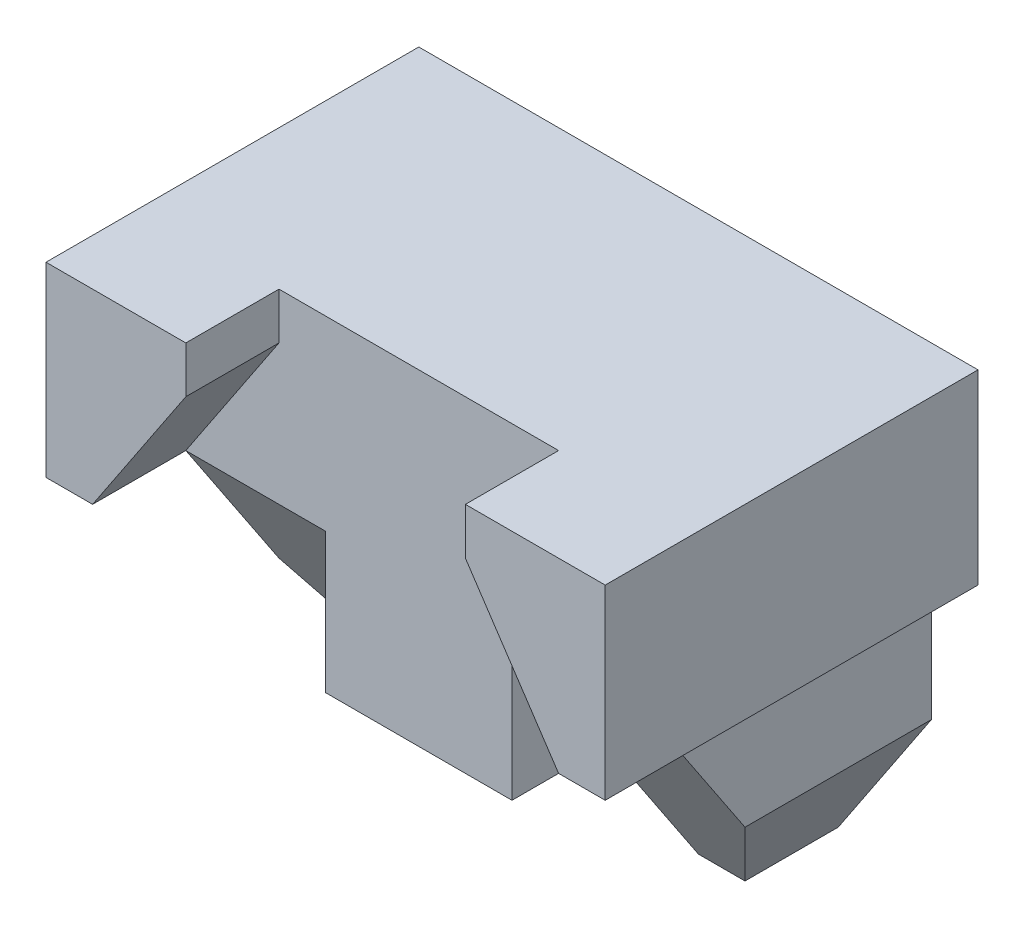
ISO-10303-21;
HEADER;
FILE_DESCRIPTION(('STEP AP214'),'2;1');
FILE_NAME('part.step','',(''),(''),'','','');
FILE_SCHEMA(('AUTOMOTIVE_DESIGN { 1 0 10303 214 1 1 1 1 }'));
ENDSEC;
DATA;
#1=APPLICATION_CONTEXT('core data for automotive mechanical design processes');
#2=APPLICATION_PROTOCOL_DEFINITION('international standard','automotive_design',2000,#1);
#3=PRODUCT_CONTEXT('',#1,'mechanical');
#4=PRODUCT('Part','Part','',(#3));
#5=PRODUCT_RELATED_PRODUCT_CATEGORY('part','',(#4));
#6=PRODUCT_DEFINITION_FORMATION('','',#4);
#7=PRODUCT_DEFINITION_CONTEXT('part definition',#1,'design');
#8=PRODUCT_DEFINITION('design','',#6,#7);
#9=PRODUCT_DEFINITION_SHAPE('','',#8);
#10=(LENGTH_UNIT() NAMED_UNIT(*) SI_UNIT(.MILLI.,.METRE.));
#11=(NAMED_UNIT(*) PLANE_ANGLE_UNIT() SI_UNIT($,.RADIAN.));
#12=(NAMED_UNIT(*) SI_UNIT($,.STERADIAN.) SOLID_ANGLE_UNIT());
#13=UNCERTAINTY_MEASURE_WITH_UNIT(LENGTH_MEASURE(1.E-05),#10,'distance_accuracy_value','');
#14=(GEOMETRIC_REPRESENTATION_CONTEXT(3) GLOBAL_UNCERTAINTY_ASSIGNED_CONTEXT((#13)) GLOBAL_UNIT_ASSIGNED_CONTEXT((#10,
#11,#12)) REPRESENTATION_CONTEXT('',''));
#15=CARTESIAN_POINT('',(0.,0.,0.));
#16=DIRECTION('',(0.,0.,1.));
#17=DIRECTION('',(1.,0.,0.));
#18=AXIS2_PLACEMENT_3D('',#15,#16,#17);
#19=CARTESIAN_POINT('',(0.,0.,60.));
#20=DIRECTION('',(0.,0.,1.));
#21=DIRECTION('',(1.,0.,0.));
#22=AXIS2_PLACEMENT_3D('',#19,#20,#21);
#23=PLANE('',#22);
#24=DIRECTION('',(1.,0.,0.));
#25=VECTOR('',#24,1.);
#26=CARTESIAN_POINT('',(50.,60.,60.));
#27=LINE('',#26,#25);
#28=CARTESIAN_POINT('',(50.,60.,60.));
#29=VERTEX_POINT('',#28);
#30=CARTESIAN_POINT('',(80.,60.,60.));
#31=VERTEX_POINT('',#30);
#32=EDGE_CURVE('E202',#29,#31,#27,.T.);
#33=ORIENTED_EDGE('',*,*,#32,.T.);
#34=DIRECTION('',(0.554700196225229,-0.832050294337844,0.));
#35=VECTOR('',#34,1.);
#36=CARTESIAN_POINT('',(80.,60.,60.));
#37=LINE('',#36,#35);
#38=CARTESIAN_POINT('',(60.,90.,60.));
#39=VERTEX_POINT('',#38);
#40=EDGE_CURVE('E349',#39,#31,#37,.T.);
#41=ORIENTED_EDGE('',*,*,#40,.F.);
#42=DIRECTION('',(0.,-1.,0.));
#43=VECTOR('',#42,1.);
#44=CARTESIAN_POINT('',(60.,90.,60.));
#45=LINE('',#44,#43);
#46=CARTESIAN_POINT('',(60.,100.,60.));
#47=VERTEX_POINT('',#46);
#48=EDGE_CURVE('E352',#47,#39,#45,.T.);
#49=ORIENTED_EDGE('',*,*,#48,.F.);
#50=DIRECTION('',(-1.,0.,0.));
#51=VECTOR('',#50,1.);
#52=CARTESIAN_POINT('',(90.,100.,60.));
#53=LINE('',#52,#51);
#54=CARTESIAN_POINT('',(0.,100.,60.));
#55=VERTEX_POINT('',#54);
#56=EDGE_CURVE('E293',#47,#55,#53,.T.);
#57=ORIENTED_EDGE('',*,*,#56,.T.);
#58=DIRECTION('',(0.,1.,0.));
#59=VECTOR('',#58,1.);
#60=CARTESIAN_POINT('',(0.,90.,60.));
#61=LINE('',#60,#59);
#62=CARTESIAN_POINT('',(0.,90.,60.));
#63=VERTEX_POINT('',#62);
#64=EDGE_CURVE('E381',#63,#55,#61,.T.);
#65=ORIENTED_EDGE('',*,*,#64,.F.);
#66=DIRECTION('',(0.554700196225229,0.832050294337844,0.));
#67=VECTOR('',#66,1.);
#68=CARTESIAN_POINT('',(-20.,60.,60.));
#69=LINE('',#68,#67);
#70=CARTESIAN_POINT('',(-20.,60.,60.));
#71=VERTEX_POINT('',#70);
#72=EDGE_CURVE('E375',#71,#63,#69,.T.);
#73=ORIENTED_EDGE('',*,*,#72,.F.);
#74=DIRECTION('',(-1.,0.,0.));
#75=VECTOR('',#74,1.);
#76=CARTESIAN_POINT('',(10.,60.,60.));
#77=LINE('',#76,#75);
#78=CARTESIAN_POINT('',(10.,60.,60.));
#79=VERTEX_POINT('',#78);
#80=EDGE_CURVE('E471',#79,#71,#77,.T.);
#81=ORIENTED_EDGE('',*,*,#80,.F.);
#82=DIRECTION('',(0.,1.,0.));
#83=VECTOR('',#82,1.);
#84=CARTESIAN_POINT('',(10.,0.,60.));
#85=LINE('',#84,#83);
#86=CARTESIAN_POINT('',(10.,30.,60.));
#87=VERTEX_POINT('',#86);
#88=EDGE_CURVE('E464',#87,#79,#85,.T.);
#89=ORIENTED_EDGE('',*,*,#88,.F.);
#90=DIRECTION('',(1.,0.,0.));
#91=VECTOR('',#90,1.);
#92=CARTESIAN_POINT('',(10.,30.,60.));
#93=LINE('',#92,#91);
#94=CARTESIAN_POINT('',(50.,30.,60.));
#95=VERTEX_POINT('',#94);
#96=EDGE_CURVE('E288',#87,#95,#93,.T.);
#97=ORIENTED_EDGE('',*,*,#96,.T.);
#98=DIRECTION('',(0.,-1.,0.));
#99=VECTOR('',#98,1.);
#100=CARTESIAN_POINT('',(50.,0.,60.));
#101=LINE('',#100,#99);
#102=EDGE_CURVE('E457',#29,#95,#101,.T.);
#103=ORIENTED_EDGE('',*,*,#102,.F.);
#104=EDGE_LOOP('',(#33,#41,#49,#57,#65,#73,#81,#89,#97,#103));
#105=FACE_BOUND('',#104,.T.);
#106=ADVANCED_FACE('F39',(#105),#23,.T.);
#107=CARTESIAN_POINT('',(-20.,30.,60.));
#108=DIRECTION('',(0.832050294337844,0.554700196225229,0.));
#109=DIRECTION('',(-0.554700196225229,0.832050294337844,0.));
#110=AXIS2_PLACEMENT_3D('',#107,#108,#109);
#111=PLANE('',#110);
#112=DIRECTION('',(0.,0.,-1.));
#113=VECTOR('',#112,1.);
#114=CARTESIAN_POINT('',(0.,0.,60.));
#115=LINE('',#114,#113);
#116=CARTESIAN_POINT('',(0.,0.,20.));
#117=VERTEX_POINT('',#116);
#118=CARTESIAN_POINT('',(0.,0.,0.));
#119=VERTEX_POINT('',#118);
#120=EDGE_CURVE('E11',#117,#119,#115,.T.);
#121=ORIENTED_EDGE('',*,*,#120,.F.);
#122=DIRECTION('',(-0.485071250072666,0.727606875108999,0.485071250072666));
#123=VECTOR('',#122,1.);
#124=CARTESIAN_POINT('',(-24.7058823529412,37.0588235294118,44.7058823529412));
#125=LINE('',#124,#123);
#126=CARTESIAN_POINT('',(-20.,30.,40.));
#127=VERTEX_POINT('',#126);
#128=EDGE_CURVE('E355',#117,#127,#125,.T.);
#129=ORIENTED_EDGE('',*,*,#128,.T.);
#130=DIRECTION('',(0.,0.,-1.));
#131=VECTOR('',#130,1.);
#132=CARTESIAN_POINT('',(-20.,30.,60.));
#133=LINE('',#132,#131);
#134=CARTESIAN_POINT('',(-20.,30.,0.));
#135=VERTEX_POINT('',#134);
#136=EDGE_CURVE('E289',#127,#135,#133,.T.);
#137=ORIENTED_EDGE('',*,*,#136,.T.);
#138=DIRECTION('',(0.554700196225229,-0.832050294337844,0.));
#139=VECTOR('',#138,1.);
#140=CARTESIAN_POINT('',(-20.,30.,0.));
#141=LINE('',#140,#139);
#142=EDGE_CURVE('E246',#135,#119,#141,.T.);
#143=ORIENTED_EDGE('',*,*,#142,.T.);
#144=EDGE_LOOP('',(#121,#129,#137,#143));
#145=FACE_BOUND('',#144,.T.);
#146=ADVANCED_FACE('F41',(#145),#111,.F.);
#147=CARTESIAN_POINT('',(0.,0.,60.));
#148=DIRECTION('',(0.,1.,0.));
#149=DIRECTION('',(0.,0.,1.));
#150=AXIS2_PLACEMENT_3D('',#147,#148,#149);
#151=PLANE('',#150);
#152=DIRECTION('',(0.,0.,-1.));
#153=VECTOR('',#152,1.);
#154=CARTESIAN_POINT('',(10.,0.,60.));
#155=LINE('',#154,#153);
#156=CARTESIAN_POINT('',(10.,0.,20.));
#157=VERTEX_POINT('',#156);
#158=CARTESIAN_POINT('',(10.,0.,0.));
#159=VERTEX_POINT('',#158);
#160=EDGE_CURVE('E48',#157,#159,#155,.T.);
#161=ORIENTED_EDGE('',*,*,#160,.F.);
#162=DIRECTION('',(-1.,0.,0.));
#163=VECTOR('',#162,1.);
#164=CARTESIAN_POINT('',(10.,0.,20.));
#165=LINE('',#164,#163);
#166=EDGE_CURVE('E474',#157,#117,#165,.T.);
#167=ORIENTED_EDGE('',*,*,#166,.T.);
#168=ORIENTED_EDGE('',*,*,#120,.T.);
#169=DIRECTION('',(1.,0.,0.));
#170=VECTOR('',#169,1.);
#171=CARTESIAN_POINT('',(0.,0.,0.));
#172=LINE('',#171,#170);
#173=EDGE_CURVE('E239',#119,#159,#172,.T.);
#174=ORIENTED_EDGE('',*,*,#173,.T.);
#175=EDGE_LOOP('',(#161,#167,#168,#174));
#176=FACE_BOUND('',#175,.T.);
#177=ADVANCED_FACE('F240',(#176),#151,.F.);
#178=CARTESIAN_POINT('',(10.,0.,60.));
#179=DIRECTION('',(-1.,0.,0.));
#180=DIRECTION('',(0.,0.,1.));
#181=AXIS2_PLACEMENT_3D('',#178,#179,#180);
#182=PLANE('',#181);
#183=DIRECTION('',(0.,0.,-1.));
#184=VECTOR('',#183,1.);
#185=CARTESIAN_POINT('',(10.,30.,60.));
#186=LINE('',#185,#184);
#187=CARTESIAN_POINT('',(10.,30.,40.));
#188=VERTEX_POINT('',#187);
#189=CARTESIAN_POINT('',(10.,30.,0.));
#190=VERTEX_POINT('',#189);
#191=EDGE_CURVE('E220',#188,#190,#186,.T.);
#192=ORIENTED_EDGE('',*,*,#191,.F.);
#193=DIRECTION('',(0.,-0.832050294337844,-0.554700196225229));
#194=VECTOR('',#193,1.);
#195=CARTESIAN_POINT('',(10.,60.,60.));
#196=LINE('',#195,#194);
#197=EDGE_CURVE('E235',#188,#157,#196,.T.);
#198=ORIENTED_EDGE('',*,*,#197,.T.);
#199=ORIENTED_EDGE('',*,*,#160,.T.);
#200=DIRECTION('',(0.,1.,0.));
#201=VECTOR('',#200,1.);
#202=CARTESIAN_POINT('',(10.,0.,0.));
#203=LINE('',#202,#201);
#204=EDGE_CURVE('E233',#159,#190,#203,.T.);
#205=ORIENTED_EDGE('',*,*,#204,.T.);
#206=EDGE_LOOP('',(#192,#198,#199,#205));
#207=FACE_BOUND('',#206,.T.);
#208=ADVANCED_FACE('F231',(#207),#182,.F.);
#209=CARTESIAN_POINT('',(10.,30.,60.));
#210=DIRECTION('',(0.,1.,0.));
#211=DIRECTION('',(0.,0.,1.));
#212=AXIS2_PLACEMENT_3D('',#209,#210,#211);
#213=PLANE('',#212);
#214=DIRECTION('',(1.,0.,0.));
#215=VECTOR('',#214,1.);
#216=CARTESIAN_POINT('',(10.,30.,0.));
#217=LINE('',#216,#215);
#218=CARTESIAN_POINT('',(50.,30.,0.));
#219=VERTEX_POINT('',#218);
#220=EDGE_CURVE('E250',#190,#219,#217,.T.);
#221=ORIENTED_EDGE('',*,*,#220,.T.);
#222=DIRECTION('',(0.,0.,-1.));
#223=VECTOR('',#222,1.);
#224=CARTESIAN_POINT('',(50.,30.,60.));
#225=LINE('',#224,#223);
#226=CARTESIAN_POINT('',(50.,30.,40.));
#227=VERTEX_POINT('',#226);
#228=EDGE_CURVE('E209',#227,#219,#225,.T.);
#229=ORIENTED_EDGE('',*,*,#228,.F.);
#230=EDGE_CURVE('E213',#95,#227,#225,.T.);
#231=ORIENTED_EDGE('',*,*,#230,.F.);
#232=ORIENTED_EDGE('',*,*,#96,.F.);
#233=EDGE_CURVE('E221',#87,#188,#186,.T.);
#234=ORIENTED_EDGE('',*,*,#233,.T.);
#235=ORIENTED_EDGE('',*,*,#191,.T.);
#236=EDGE_LOOP('',(#221,#229,#231,#232,#234,#235));
#237=FACE_BOUND('',#236,.T.);
#238=ADVANCED_FACE('F522',(#237),#213,.F.);
#239=CARTESIAN_POINT('',(50.,30.,60.));
#240=DIRECTION('',(1.,0.,0.));
#241=DIRECTION('',(0.,0.,-1.));
#242=AXIS2_PLACEMENT_3D('',#239,#240,#241);
#243=PLANE('',#242);
#244=DIRECTION('',(0.,0.,-1.));
#245=VECTOR('',#244,1.);
#246=CARTESIAN_POINT('',(50.,0.,60.));
#247=LINE('',#246,#245);
#248=CARTESIAN_POINT('',(50.,0.,20.));
#249=VERTEX_POINT('',#248);
#250=CARTESIAN_POINT('',(50.,0.,0.));
#251=VERTEX_POINT('',#250);
#252=EDGE_CURVE('E198',#249,#251,#247,.T.);
#253=ORIENTED_EDGE('',*,*,#252,.F.);
#254=DIRECTION('',(0.,0.832050294337844,0.554700196225229));
#255=VECTOR('',#254,1.);
#256=CARTESIAN_POINT('',(50.,60.,60.));
#257=LINE('',#256,#255);
#258=EDGE_CURVE('E183',#249,#227,#257,.T.);
#259=ORIENTED_EDGE('',*,*,#258,.T.);
#260=ORIENTED_EDGE('',*,*,#228,.T.);
#261=DIRECTION('',(0.,-1.,0.));
#262=VECTOR('',#261,1.);
#263=CARTESIAN_POINT('',(50.,30.,0.));
#264=LINE('',#263,#262);
#265=EDGE_CURVE('E206',#219,#251,#264,.T.);
#266=ORIENTED_EDGE('',*,*,#265,.T.);
#267=EDGE_LOOP('',(#253,#259,#260,#266));
#268=FACE_BOUND('',#267,.T.);
#269=ADVANCED_FACE('F204',(#268),#243,.F.);
#270=CARTESIAN_POINT('',(50.,0.,60.));
#271=DIRECTION('',(0.,1.,0.));
#272=DIRECTION('',(0.,0.,1.));
#273=AXIS2_PLACEMENT_3D('',#270,#271,#272);
#274=PLANE('',#273);
#275=DIRECTION('',(0.,0.,-1.));
#276=VECTOR('',#275,1.);
#277=CARTESIAN_POINT('',(60.,0.,60.));
#278=LINE('',#277,#276);
#279=CARTESIAN_POINT('',(60.,0.,20.));
#280=VERTEX_POINT('',#279);
#281=CARTESIAN_POINT('',(60.,0.,0.));
#282=VERTEX_POINT('',#281);
#283=EDGE_CURVE('E200',#280,#282,#278,.T.);
#284=ORIENTED_EDGE('',*,*,#283,.F.);
#285=DIRECTION('',(1.,0.,0.));
#286=VECTOR('',#285,1.);
#287=CARTESIAN_POINT('',(50.,0.,20.));
#288=LINE('',#287,#286);
#289=EDGE_CURVE('E186',#249,#280,#288,.T.);
#290=ORIENTED_EDGE('',*,*,#289,.F.);
#291=ORIENTED_EDGE('',*,*,#252,.T.);
#292=DIRECTION('',(1.,0.,0.));
#293=VECTOR('',#292,1.);
#294=CARTESIAN_POINT('',(50.,0.,0.));
#295=LINE('',#294,#293);
#296=EDGE_CURVE('E259',#251,#282,#295,.T.);
#297=ORIENTED_EDGE('',*,*,#296,.T.);
#298=EDGE_LOOP('',(#284,#290,#291,#297));
#299=FACE_BOUND('',#298,.T.);
#300=ADVANCED_FACE('F196',(#299),#274,.F.);
#301=CARTESIAN_POINT('',(60.,0.,60.));
#302=DIRECTION('',(-0.832050294337844,0.554700196225229,0.));
#303=DIRECTION('',(-0.554700196225229,-0.832050294337844,0.));
#304=AXIS2_PLACEMENT_3D('',#301,#302,#303);
#305=PLANE('',#304);
#306=DIRECTION('',(0.,0.,-1.));
#307=VECTOR('',#306,1.);
#308=CARTESIAN_POINT('',(80.,30.,60.));
#309=LINE('',#308,#307);
#310=CARTESIAN_POINT('',(80.,30.,40.));
#311=VERTEX_POINT('',#310);
#312=CARTESIAN_POINT('',(80.,30.,0.));
#313=VERTEX_POINT('',#312);
#314=EDGE_CURVE('E215',#311,#313,#309,.T.);
#315=ORIENTED_EDGE('',*,*,#314,.F.);
#316=DIRECTION('',(-0.485071250072666,-0.727606875108999,-0.485071250072666));
#317=VECTOR('',#316,1.);
#318=CARTESIAN_POINT('',(69.4117647058823,14.1176470588235,29.4117647058824));
#319=LINE('',#318,#317);
#320=EDGE_CURVE('E55',#311,#280,#319,.T.);
#321=ORIENTED_EDGE('',*,*,#320,.T.);
#322=ORIENTED_EDGE('',*,*,#283,.T.);
#323=DIRECTION('',(0.554700196225229,0.832050294337844,0.));
#324=VECTOR('',#323,1.);
#325=CARTESIAN_POINT('',(60.,0.,0.));
#326=LINE('',#325,#324);
#327=EDGE_CURVE('E262',#282,#313,#326,.T.);
#328=ORIENTED_EDGE('',*,*,#327,.T.);
#329=EDGE_LOOP('',(#315,#321,#322,#328));
#330=FACE_BOUND('',#329,.T.);
#331=ADVANCED_FACE('F325',(#330),#305,.F.);
#332=CARTESIAN_POINT('',(80.,30.,60.));
#333=DIRECTION('',(-1.,0.,0.));
#334=DIRECTION('',(0.,0.,1.));
#335=AXIS2_PLACEMENT_3D('',#332,#333,#334);
#336=PLANE('',#335);
#337=DIRECTION('',(0.,0.,-1.));
#338=VECTOR('',#337,1.);
#339=CARTESIAN_POINT('',(80.,60.,60.));
#340=LINE('',#339,#338);
#341=CARTESIAN_POINT('',(80.,60.,0.));
#342=VERTEX_POINT('',#341);
#343=EDGE_CURVE('E313',#31,#342,#340,.T.);
#344=ORIENTED_EDGE('',*,*,#343,.F.);
#345=DIRECTION('',(0.,0.832050294337844,0.554700196225229));
#346=VECTOR('',#345,1.);
#347=CARTESIAN_POINT('',(80.,60.,60.));
#348=LINE('',#347,#346);
#349=EDGE_CURVE('E322',#311,#31,#348,.T.);
#350=ORIENTED_EDGE('',*,*,#349,.F.);
#351=ORIENTED_EDGE('',*,*,#314,.T.);
#352=DIRECTION('',(0.,1.,0.));
#353=VECTOR('',#352,1.);
#354=CARTESIAN_POINT('',(80.,30.,0.));
#355=LINE('',#354,#353);
#356=EDGE_CURVE('E266',#313,#342,#355,.T.);
#357=ORIENTED_EDGE('',*,*,#356,.T.);
#358=EDGE_LOOP('',(#344,#350,#351,#357));
#359=FACE_BOUND('',#358,.T.);
#360=ADVANCED_FACE('F320',(#359),#336,.F.);
#361=CARTESIAN_POINT('',(80.,60.,60.));
#362=DIRECTION('',(0.,1.,0.));
#363=DIRECTION('',(0.,0.,1.));
#364=AXIS2_PLACEMENT_3D('',#361,#362,#363);
#365=PLANE('',#364);
#366=DIRECTION('',(1.,0.,0.));
#367=VECTOR('',#366,1.);
#368=CARTESIAN_POINT('',(80.,60.,0.));
#369=LINE('',#368,#367);
#370=CARTESIAN_POINT('',(90.,60.,0.));
#371=VERTEX_POINT('',#370);
#372=EDGE_CURVE('E269',#342,#371,#369,.T.);
#373=ORIENTED_EDGE('',*,*,#372,.T.);
#374=DIRECTION('',(0.,0.,-1.));
#375=VECTOR('',#374,1.);
#376=CARTESIAN_POINT('',(90.,60.,60.));
#377=LINE('',#376,#375);
#378=CARTESIAN_POINT('',(90.,60.,80.));
#379=VERTEX_POINT('',#378);
#380=EDGE_CURVE('E309',#379,#371,#377,.T.);
#381=ORIENTED_EDGE('',*,*,#380,.F.);
#382=DIRECTION('',(1.,0.,0.));
#383=VECTOR('',#382,1.);
#384=CARTESIAN_POINT('',(90.,60.,80.));
#385=LINE('',#384,#383);
#386=CARTESIAN_POINT('',(80.,60.,80.));
#387=VERTEX_POINT('',#386);
#388=EDGE_CURVE('E343',#387,#379,#385,.T.);
#389=ORIENTED_EDGE('',*,*,#388,.F.);
#390=DIRECTION('',(0.,0.,-1.));
#391=VECTOR('',#390,1.);
#392=CARTESIAN_POINT('',(80.,60.,80.));
#393=LINE('',#392,#391);
#394=EDGE_CURVE('E365',#387,#31,#393,.T.);
#395=ORIENTED_EDGE('',*,*,#394,.T.);
#396=ORIENTED_EDGE('',*,*,#343,.T.);
#397=EDGE_LOOP('',(#373,#381,#389,#395,#396));
#398=FACE_BOUND('',#397,.T.);
#399=ADVANCED_FACE('F330',(#398),#365,.F.);
#400=CARTESIAN_POINT('',(90.,60.,60.));
#401=DIRECTION('',(-1.,0.,0.));
#402=DIRECTION('',(0.,0.,1.));
#403=AXIS2_PLACEMENT_3D('',#400,#401,#402);
#404=PLANE('',#403);
#405=DIRECTION('',(0.,1.,0.));
#406=VECTOR('',#405,1.);
#407=CARTESIAN_POINT('',(90.,60.,0.));
#408=LINE('',#407,#406);
#409=CARTESIAN_POINT('',(90.,100.,0.));
#410=VERTEX_POINT('',#409);
#411=EDGE_CURVE('E272',#371,#410,#408,.T.);
#412=ORIENTED_EDGE('',*,*,#411,.T.);
#413=DIRECTION('',(0.,0.,-1.));
#414=VECTOR('',#413,1.);
#415=CARTESIAN_POINT('',(90.,100.,60.));
#416=LINE('',#415,#414);
#417=CARTESIAN_POINT('',(90.,100.,80.));
#418=VERTEX_POINT('',#417);
#419=EDGE_CURVE('E305',#418,#410,#416,.T.);
#420=ORIENTED_EDGE('',*,*,#419,.F.);
#421=DIRECTION('',(0.,1.,0.));
#422=VECTOR('',#421,1.);
#423=CARTESIAN_POINT('',(90.,100.,80.));
#424=LINE('',#423,#422);
#425=EDGE_CURVE('E337',#379,#418,#424,.T.);
#426=ORIENTED_EDGE('',*,*,#425,.F.);
#427=ORIENTED_EDGE('',*,*,#380,.T.);
#428=EDGE_LOOP('',(#412,#420,#426,#427));
#429=FACE_BOUND('',#428,.T.);
#430=ADVANCED_FACE('F335',(#429),#404,.F.);
#431=CARTESIAN_POINT('',(90.,100.,60.));
#432=DIRECTION('',(0.,-1.,0.));
#433=DIRECTION('',(0.,0.,-1.));
#434=AXIS2_PLACEMENT_3D('',#431,#432,#433);
#435=PLANE('',#434);
#436=DIRECTION('',(-1.,0.,0.));
#437=VECTOR('',#436,1.);
#438=CARTESIAN_POINT('',(90.,100.,0.));
#439=LINE('',#438,#437);
#440=CARTESIAN_POINT('',(-30.,100.,0.));
#441=VERTEX_POINT('',#440);
#442=EDGE_CURVE('E275',#410,#441,#439,.T.);
#443=ORIENTED_EDGE('',*,*,#442,.T.);
#444=DIRECTION('',(0.,0.,-1.));
#445=VECTOR('',#444,1.);
#446=CARTESIAN_POINT('',(-30.,100.,60.));
#447=LINE('',#446,#445);
#448=CARTESIAN_POINT('',(-30.,100.,80.));
#449=VERTEX_POINT('',#448);
#450=EDGE_CURVE('E301',#449,#441,#447,.T.);
#451=ORIENTED_EDGE('',*,*,#450,.F.);
#452=DIRECTION('',(-1.,0.,0.));
#453=VECTOR('',#452,1.);
#454=CARTESIAN_POINT('',(0.,100.,80.));
#455=LINE('',#454,#453);
#456=CARTESIAN_POINT('',(0.,100.,80.));
#457=VERTEX_POINT('',#456);
#458=EDGE_CURVE('E387',#457,#449,#455,.T.);
#459=ORIENTED_EDGE('',*,*,#458,.F.);
#460=DIRECTION('',(0.,0.,-1.));
#461=VECTOR('',#460,1.);
#462=CARTESIAN_POINT('',(0.,100.,80.));
#463=LINE('',#462,#461);
#464=EDGE_CURVE('E395',#457,#55,#463,.T.);
#465=ORIENTED_EDGE('',*,*,#464,.T.);
#466=ORIENTED_EDGE('',*,*,#56,.F.);
#467=DIRECTION('',(0.,0.,-1.));
#468=VECTOR('',#467,1.);
#469=CARTESIAN_POINT('',(60.,100.,80.));
#470=LINE('',#469,#468);
#471=CARTESIAN_POINT('',(60.,100.,80.));
#472=VERTEX_POINT('',#471);
#473=EDGE_CURVE('E372',#472,#47,#470,.T.);
#474=ORIENTED_EDGE('',*,*,#473,.F.);
#475=DIRECTION('',(-1.,0.,0.));
#476=VECTOR('',#475,1.);
#477=CARTESIAN_POINT('',(60.,100.,80.));
#478=LINE('',#477,#476);
#479=EDGE_CURVE('E342',#418,#472,#478,.T.);
#480=ORIENTED_EDGE('',*,*,#479,.F.);
#481=ORIENTED_EDGE('',*,*,#419,.T.);
#482=EDGE_LOOP('',(#443,#451,#459,#465,#466,#474,#480,#481));
#483=FACE_BOUND('',#482,.T.);
#484=ADVANCED_FACE('F444',(#483),#435,.F.);
#485=CARTESIAN_POINT('',(-30.,100.,60.));
#486=DIRECTION('',(1.,0.,0.));
#487=DIRECTION('',(0.,0.,-1.));
#488=AXIS2_PLACEMENT_3D('',#485,#486,#487);
#489=PLANE('',#488);
#490=DIRECTION('',(0.,-1.,0.));
#491=VECTOR('',#490,1.);
#492=CARTESIAN_POINT('',(-30.,100.,0.));
#493=LINE('',#492,#491);
#494=CARTESIAN_POINT('',(-30.,60.,0.));
#495=VERTEX_POINT('',#494);
#496=EDGE_CURVE('E278',#441,#495,#493,.T.);
#497=ORIENTED_EDGE('',*,*,#496,.T.);
#498=DIRECTION('',(0.,0.,-1.));
#499=VECTOR('',#498,1.);
#500=CARTESIAN_POINT('',(-30.,60.,60.));
#501=LINE('',#500,#499);
#502=CARTESIAN_POINT('',(-30.,60.,80.));
#503=VERTEX_POINT('',#502);
#504=EDGE_CURVE('E297',#503,#495,#501,.T.);
#505=ORIENTED_EDGE('',*,*,#504,.F.);
#506=DIRECTION('',(0.,-1.,0.));
#507=VECTOR('',#506,1.);
#508=CARTESIAN_POINT('',(-30.,100.,80.));
#509=LINE('',#508,#507);
#510=EDGE_CURVE('E391',#449,#503,#509,.T.);
#511=ORIENTED_EDGE('',*,*,#510,.F.);
#512=ORIENTED_EDGE('',*,*,#450,.T.);
#513=EDGE_LOOP('',(#497,#505,#511,#512));
#514=FACE_BOUND('',#513,.T.);
#515=ADVANCED_FACE('F442',(#514),#489,.F.);
#516=CARTESIAN_POINT('',(-30.,60.,60.));
#517=DIRECTION('',(0.,1.,0.));
#518=DIRECTION('',(0.,0.,1.));
#519=AXIS2_PLACEMENT_3D('',#516,#517,#518);
#520=PLANE('',#519);
#521=DIRECTION('',(1.,0.,0.));
#522=VECTOR('',#521,1.);
#523=CARTESIAN_POINT('',(-30.,60.,0.));
#524=LINE('',#523,#522);
#525=CARTESIAN_POINT('',(-20.,60.,0.));
#526=VERTEX_POINT('',#525);
#527=EDGE_CURVE('E281',#495,#526,#524,.T.);
#528=ORIENTED_EDGE('',*,*,#527,.T.);
#529=DIRECTION('',(0.,0.,-1.));
#530=VECTOR('',#529,1.);
#531=CARTESIAN_POINT('',(-20.,60.,60.));
#532=LINE('',#531,#530);
#533=EDGE_CURVE('E292',#71,#526,#532,.T.);
#534=ORIENTED_EDGE('',*,*,#533,.F.);
#535=DIRECTION('',(0.,0.,-1.));
#536=VECTOR('',#535,1.);
#537=CARTESIAN_POINT('',(-20.,60.,80.));
#538=LINE('',#537,#536);
#539=CARTESIAN_POINT('',(-20.,60.,80.));
#540=VERTEX_POINT('',#539);
#541=EDGE_CURVE('E409',#540,#71,#538,.T.);
#542=ORIENTED_EDGE('',*,*,#541,.F.);
#543=DIRECTION('',(1.,0.,0.));
#544=VECTOR('',#543,1.);
#545=CARTESIAN_POINT('',(-30.,60.,80.));
#546=LINE('',#545,#544);
#547=EDGE_CURVE('E376',#503,#540,#546,.T.);
#548=ORIENTED_EDGE('',*,*,#547,.F.);
#549=ORIENTED_EDGE('',*,*,#504,.T.);
#550=EDGE_LOOP('',(#528,#534,#542,#548,#549));
#551=FACE_BOUND('',#550,.T.);
#552=ADVANCED_FACE('F432',(#551),#520,.F.);
#553=CARTESIAN_POINT('',(-20.,60.,60.));
#554=DIRECTION('',(1.,0.,0.));
#555=DIRECTION('',(0.,1.,0.));
#556=AXIS2_PLACEMENT_3D('',#553,#554,#555);
#557=PLANE('',#556);
#558=ORIENTED_EDGE('',*,*,#136,.F.);
#559=DIRECTION('',(0.,-0.832050294337844,-0.554700196225229));
#560=VECTOR('',#559,1.);
#561=CARTESIAN_POINT('',(-20.,60.,60.));
#562=LINE('',#561,#560);
#563=EDGE_CURVE('E428',#71,#127,#562,.T.);
#564=ORIENTED_EDGE('',*,*,#563,.F.);
#565=ORIENTED_EDGE('',*,*,#533,.T.);
#566=DIRECTION('',(0.,-1.,0.));
#567=VECTOR('',#566,1.);
#568=CARTESIAN_POINT('',(-20.,60.,0.));
#569=LINE('',#568,#567);
#570=EDGE_CURVE('E284',#526,#135,#569,.T.);
#571=ORIENTED_EDGE('',*,*,#570,.T.);
#572=EDGE_LOOP('',(#558,#564,#565,#571));
#573=FACE_BOUND('',#572,.T.);
#574=ADVANCED_FACE('F425',(#573),#557,.F.);
#575=CARTESIAN_POINT('',(0.,0.,0.));
#576=DIRECTION('',(0.,0.,1.));
#577=DIRECTION('',(1.,0.,0.));
#578=AXIS2_PLACEMENT_3D('',#575,#576,#577);
#579=PLANE('',#578);
#580=ORIENTED_EDGE('',*,*,#142,.F.);
#581=ORIENTED_EDGE('',*,*,#570,.F.);
#582=ORIENTED_EDGE('',*,*,#527,.F.);
#583=ORIENTED_EDGE('',*,*,#496,.F.);
#584=ORIENTED_EDGE('',*,*,#442,.F.);
#585=ORIENTED_EDGE('',*,*,#411,.F.);
#586=ORIENTED_EDGE('',*,*,#372,.F.);
#587=ORIENTED_EDGE('',*,*,#356,.F.);
#588=ORIENTED_EDGE('',*,*,#327,.F.);
#589=ORIENTED_EDGE('',*,*,#296,.F.);
#590=ORIENTED_EDGE('',*,*,#265,.F.);
#591=ORIENTED_EDGE('',*,*,#220,.F.);
#592=ORIENTED_EDGE('',*,*,#204,.F.);
#593=ORIENTED_EDGE('',*,*,#173,.F.);
#594=EDGE_LOOP('',(#580,#581,#582,#583,#584,#585,#586,#587,#588,#589,#590,#591,#592,#593));
#595=FACE_BOUND('',#594,.T.);
#596=ADVANCED_FACE('F248',(#595),#579,.F.);
#597=CARTESIAN_POINT('',(-20.,60.,80.));
#598=DIRECTION('',(-0.832050294337844,0.554700196225229,0.));
#599=DIRECTION('',(-0.554700196225229,-0.832050294337844,0.));
#600=AXIS2_PLACEMENT_3D('',#597,#598,#599);
#601=PLANE('',#600);
#602=ORIENTED_EDGE('',*,*,#72,.T.);
#603=DIRECTION('',(0.,0.,-1.));
#604=VECTOR('',#603,1.);
#605=CARTESIAN_POINT('',(0.,90.,80.));
#606=LINE('',#605,#604);
#607=CARTESIAN_POINT('',(0.,90.,80.));
#608=VERTEX_POINT('',#607);
#609=EDGE_CURVE('E405',#608,#63,#606,.T.);
#610=ORIENTED_EDGE('',*,*,#609,.F.);
#611=DIRECTION('',(0.554700196225229,0.832050294337844,0.));
#612=VECTOR('',#611,1.);
#613=CARTESIAN_POINT('',(-20.,60.,80.));
#614=LINE('',#613,#612);
#615=EDGE_CURVE('E380',#540,#608,#614,.T.);
#616=ORIENTED_EDGE('',*,*,#615,.F.);
#617=ORIENTED_EDGE('',*,*,#541,.T.);
#618=EDGE_LOOP('',(#602,#610,#616,#617));
#619=FACE_BOUND('',#618,.T.);
#620=ADVANCED_FACE('F435',(#619),#601,.F.);
#621=CARTESIAN_POINT('',(0.,90.,80.));
#622=DIRECTION('',(-1.,0.,0.));
#623=DIRECTION('',(0.,0.,1.));
#624=AXIS2_PLACEMENT_3D('',#621,#622,#623);
#625=PLANE('',#624);
#626=ORIENTED_EDGE('',*,*,#64,.T.);
#627=ORIENTED_EDGE('',*,*,#464,.F.);
#628=DIRECTION('',(0.,1.,0.));
#629=VECTOR('',#628,1.);
#630=CARTESIAN_POINT('',(0.,90.,80.));
#631=LINE('',#630,#629);
#632=EDGE_CURVE('E384',#608,#457,#631,.T.);
#633=ORIENTED_EDGE('',*,*,#632,.F.);
#634=ORIENTED_EDGE('',*,*,#609,.T.);
#635=EDGE_LOOP('',(#626,#627,#633,#634));
#636=FACE_BOUND('',#635,.T.);
#637=ADVANCED_FACE('F485',(#636),#625,.F.);
#638=CARTESIAN_POINT('',(0.,0.,80.));
#639=DIRECTION('',(0.,0.,1.));
#640=DIRECTION('',(1.,0.,0.));
#641=AXIS2_PLACEMENT_3D('',#638,#639,#640);
#642=PLANE('',#641);
#643=ORIENTED_EDGE('',*,*,#547,.T.);
#644=ORIENTED_EDGE('',*,*,#615,.T.);
#645=ORIENTED_EDGE('',*,*,#632,.T.);
#646=ORIENTED_EDGE('',*,*,#458,.T.);
#647=ORIENTED_EDGE('',*,*,#510,.T.);
#648=EDGE_LOOP('',(#643,#644,#645,#646,#647));
#649=FACE_BOUND('',#648,.T.);
#650=ADVANCED_FACE('F439',(#649),#642,.T.);
#651=CARTESIAN_POINT('',(60.,90.,80.));
#652=DIRECTION('',(1.,0.,0.));
#653=DIRECTION('',(0.,0.,-1.));
#654=AXIS2_PLACEMENT_3D('',#651,#652,#653);
#655=PLANE('',#654);
#656=ORIENTED_EDGE('',*,*,#48,.T.);
#657=DIRECTION('',(0.,0.,-1.));
#658=VECTOR('',#657,1.);
#659=CARTESIAN_POINT('',(60.,90.,80.));
#660=LINE('',#659,#658);
#661=CARTESIAN_POINT('',(60.,90.,80.));
#662=VERTEX_POINT('',#661);
#663=EDGE_CURVE('E63',#662,#39,#660,.T.);
#664=ORIENTED_EDGE('',*,*,#663,.F.);
#665=DIRECTION('',(0.,-1.,0.));
#666=VECTOR('',#665,1.);
#667=CARTESIAN_POINT('',(60.,90.,80.));
#668=LINE('',#667,#666);
#669=EDGE_CURVE('E360',#472,#662,#668,.T.);
#670=ORIENTED_EDGE('',*,*,#669,.F.);
#671=ORIENTED_EDGE('',*,*,#473,.T.);
#672=EDGE_LOOP('',(#656,#664,#670,#671));
#673=FACE_BOUND('',#672,.T.);
#674=ADVANCED_FACE('F450',(#673),#655,.F.);
#675=CARTESIAN_POINT('',(80.,60.,80.));
#676=DIRECTION('',(0.832050294337844,0.554700196225229,0.));
#677=DIRECTION('',(-0.554700196225229,0.832050294337844,0.));
#678=AXIS2_PLACEMENT_3D('',#675,#676,#677);
#679=PLANE('',#678);
#680=ORIENTED_EDGE('',*,*,#40,.T.);
#681=ORIENTED_EDGE('',*,*,#394,.F.);
#682=DIRECTION('',(0.554700196225229,-0.832050294337844,0.));
#683=VECTOR('',#682,1.);
#684=CARTESIAN_POINT('',(80.,60.,80.));
#685=LINE('',#684,#683);
#686=EDGE_CURVE('E346',#662,#387,#685,.T.);
#687=ORIENTED_EDGE('',*,*,#686,.F.);
#688=ORIENTED_EDGE('',*,*,#663,.T.);
#689=EDGE_LOOP('',(#680,#681,#687,#688));
#690=FACE_BOUND('',#689,.T.);
#691=ADVANCED_FACE('F453',(#690),#679,.F.);
#692=CARTESIAN_POINT('',(0.,0.,80.));
#693=DIRECTION('',(0.,0.,-1.));
#694=DIRECTION('',(-1.,0.,0.));
#695=AXIS2_PLACEMENT_3D('',#692,#693,#694);
#696=PLANE('',#695);
#697=ORIENTED_EDGE('',*,*,#388,.T.);
#698=ORIENTED_EDGE('',*,*,#425,.T.);
#699=ORIENTED_EDGE('',*,*,#479,.T.);
#700=ORIENTED_EDGE('',*,*,#669,.T.);
#701=ORIENTED_EDGE('',*,*,#686,.T.);
#702=EDGE_LOOP('',(#697,#698,#699,#700,#701));
#703=FACE_BOUND('',#702,.T.);
#704=ADVANCED_FACE('F345',(#703),#696,.F.);
#705=CARTESIAN_POINT('',(10.,0.,0.));
#706=DIRECTION('',(1.,0.,0.));
#707=DIRECTION('',(0.,1.,0.));
#708=AXIS2_PLACEMENT_3D('',#705,#706,#707);
#709=PLANE('',#708);
#710=ORIENTED_EDGE('',*,*,#88,.T.);
#711=EDGE_CURVE('E467',#79,#188,#196,.T.);
#712=ORIENTED_EDGE('',*,*,#711,.T.);
#713=ORIENTED_EDGE('',*,*,#233,.F.);
#714=EDGE_LOOP('',(#710,#712,#713));
#715=FACE_BOUND('',#714,.T.);
#716=ADVANCED_FACE('F595',(#715),#709,.F.);
#717=CARTESIAN_POINT('',(10.,60.,60.));
#718=DIRECTION('',(0.,0.554700196225229,-0.832050294337844));
#719=DIRECTION('',(0.,0.832050294337844,0.554700196225229));
#720=AXIS2_PLACEMENT_3D('',#717,#718,#719);
#721=PLANE('',#720);
#722=ORIENTED_EDGE('',*,*,#166,.F.);
#723=ORIENTED_EDGE('',*,*,#197,.F.);
#724=ORIENTED_EDGE('',*,*,#711,.F.);
#725=ORIENTED_EDGE('',*,*,#80,.T.);
#726=ORIENTED_EDGE('',*,*,#563,.T.);
#727=ORIENTED_EDGE('',*,*,#128,.F.);
#728=EDGE_LOOP('',(#722,#723,#724,#725,#726,#727));
#729=FACE_BOUND('',#728,.T.);
#730=ADVANCED_FACE('F480',(#729),#721,.F.);
#731=CARTESIAN_POINT('',(50.,0.,0.));
#732=DIRECTION('',(1.,0.,0.));
#733=DIRECTION('',(0.,0.,-1.));
#734=AXIS2_PLACEMENT_3D('',#731,#732,#733);
#735=PLANE('',#734);
#736=ORIENTED_EDGE('',*,*,#230,.T.);
#737=EDGE_CURVE('E188',#227,#29,#257,.T.);
#738=ORIENTED_EDGE('',*,*,#737,.T.);
#739=ORIENTED_EDGE('',*,*,#102,.T.);
#740=EDGE_LOOP('',(#736,#738,#739));
#741=FACE_BOUND('',#740,.T.);
#742=ADVANCED_FACE('F610',(#741),#735,.T.);
#743=CARTESIAN_POINT('',(50.,60.,60.));
#744=DIRECTION('',(0.,0.554700196225229,-0.832050294337844));
#745=DIRECTION('',(0.,0.832050294337844,0.554700196225229));
#746=AXIS2_PLACEMENT_3D('',#743,#744,#745);
#747=PLANE('',#746);
#748=ORIENTED_EDGE('',*,*,#349,.T.);
#749=ORIENTED_EDGE('',*,*,#32,.F.);
#750=ORIENTED_EDGE('',*,*,#737,.F.);
#751=ORIENTED_EDGE('',*,*,#258,.F.);
#752=ORIENTED_EDGE('',*,*,#289,.T.);
#753=ORIENTED_EDGE('',*,*,#320,.F.);
#754=EDGE_LOOP('',(#748,#749,#750,#751,#752,#753));
#755=FACE_BOUND('',#754,.T.);
#756=ADVANCED_FACE('F185',(#755),#747,.F.);
#757=CLOSED_SHELL('',(#106,#146,#177,#208,#238,#269,#300,#331,#360,#399,#430,#484,#515,#552,
#574,#596,#620,#637,#650,#674,#691,#704,#716,#730,#742,#756));
#758=MANIFOLD_SOLID_BREP('B2',#757);
#759=ADVANCED_BREP_SHAPE_REPRESENTATION('',(#18,#758),#14);
#760=SHAPE_DEFINITION_REPRESENTATION(#9,#759);
ENDSEC;
END-ISO-10303-21;
